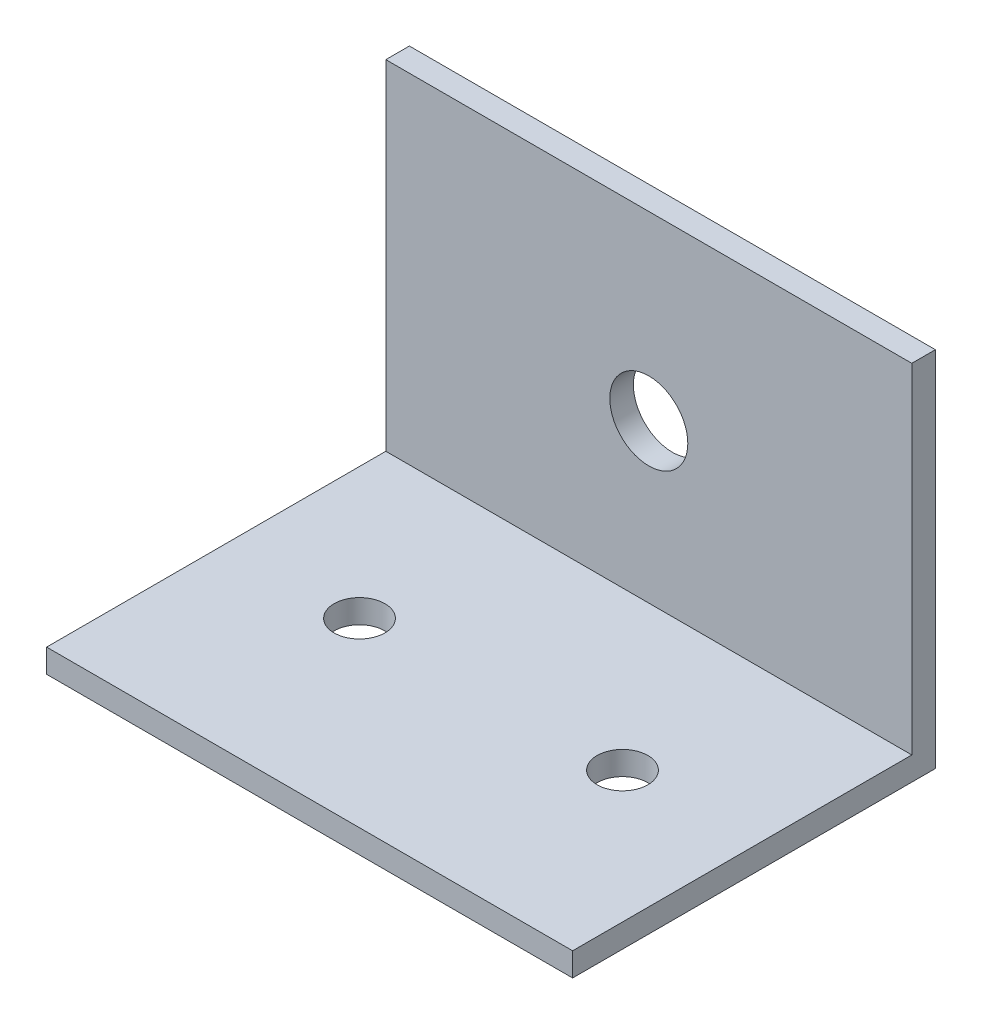
ISO-10303-21;
HEADER;
FILE_DESCRIPTION(('STEP AP214'),'2;1');
FILE_NAME('part.step','',(''),(''),'','','');
FILE_SCHEMA(('AUTOMOTIVE_DESIGN { 1 0 10303 214 1 1 1 1 }'));
ENDSEC;
DATA;
#1=APPLICATION_CONTEXT('core data for automotive mechanical design processes');
#2=APPLICATION_PROTOCOL_DEFINITION('international standard','automotive_design',2000,#1);
#3=PRODUCT_CONTEXT('',#1,'mechanical');
#4=PRODUCT('Part','Part','',(#3));
#5=PRODUCT_RELATED_PRODUCT_CATEGORY('part','',(#4));
#6=PRODUCT_DEFINITION_FORMATION('','',#4);
#7=PRODUCT_DEFINITION_CONTEXT('part definition',#1,'design');
#8=PRODUCT_DEFINITION('design','',#6,#7);
#9=PRODUCT_DEFINITION_SHAPE('','',#8);
#10=(LENGTH_UNIT() NAMED_UNIT(*) SI_UNIT(.MILLI.,.METRE.));
#11=(NAMED_UNIT(*) PLANE_ANGLE_UNIT() SI_UNIT($,.RADIAN.));
#12=(NAMED_UNIT(*) SI_UNIT($,.STERADIAN.) SOLID_ANGLE_UNIT());
#13=UNCERTAINTY_MEASURE_WITH_UNIT(LENGTH_MEASURE(1.E-05),#10,'distance_accuracy_value','');
#14=(GEOMETRIC_REPRESENTATION_CONTEXT(3) GLOBAL_UNCERTAINTY_ASSIGNED_CONTEXT((#13)) GLOBAL_UNIT_ASSIGNED_CONTEXT((#10,
#11,#12)) REPRESENTATION_CONTEXT('',''));
#15=CARTESIAN_POINT('',(0.,0.,0.));
#16=DIRECTION('',(0.,0.,1.));
#17=DIRECTION('',(1.,0.,0.));
#18=AXIS2_PLACEMENT_3D('',#15,#16,#17);
#19=CARTESIAN_POINT('',(36.83,25.4,3.302));
#20=DIRECTION('',(-1.,0.,0.));
#21=DIRECTION('',(0.,0.,1.));
#22=AXIS2_PLACEMENT_3D('',#19,#20,#21);
#23=PLANE('',#22);
#24=DIRECTION('',(0.,1.,0.));
#25=VECTOR('',#24,1.);
#26=CARTESIAN_POINT('',(36.83,25.4,0.));
#27=LINE('',#26,#25);
#28=CARTESIAN_POINT('',(36.83,-25.4,0.));
#29=VERTEX_POINT('',#28);
#30=CARTESIAN_POINT('',(36.83,25.4,0.));
#31=VERTEX_POINT('',#30);
#32=EDGE_CURVE('E102',#29,#31,#27,.T.);
#33=ORIENTED_EDGE('',*,*,#32,.T.);
#34=DIRECTION('',(0.,0.,-1.));
#35=VECTOR('',#34,1.);
#36=CARTESIAN_POINT('',(36.83,25.4,3.302));
#37=LINE('',#36,#35);
#38=CARTESIAN_POINT('',(36.83,25.4,3.302));
#39=VERTEX_POINT('',#38);
#40=EDGE_CURVE('E11',#39,#31,#37,.T.);
#41=ORIENTED_EDGE('',*,*,#40,.F.);
#42=DIRECTION('',(0.,1.,0.));
#43=VECTOR('',#42,1.);
#44=CARTESIAN_POINT('',(36.83,25.4,3.302));
#45=LINE('',#44,#43);
#46=CARTESIAN_POINT('',(36.83,-22.098,3.302));
#47=VERTEX_POINT('',#46);
#48=EDGE_CURVE('E95',#47,#39,#45,.T.);
#49=ORIENTED_EDGE('',*,*,#48,.F.);
#50=DIRECTION('',(0.,0.,-1.));
#51=VECTOR('',#50,1.);
#52=CARTESIAN_POINT('',(36.83,-22.098,50.8));
#53=LINE('',#52,#51);
#54=CARTESIAN_POINT('',(36.83,-22.098,50.8));
#55=VERTEX_POINT('',#54);
#56=EDGE_CURVE('E110',#55,#47,#53,.T.);
#57=ORIENTED_EDGE('',*,*,#56,.F.);
#58=DIRECTION('',(0.,1.,0.));
#59=VECTOR('',#58,1.);
#60=CARTESIAN_POINT('',(36.83,-25.4,50.8));
#61=LINE('',#60,#59);
#62=CARTESIAN_POINT('',(36.83,-25.4,50.8));
#63=VERTEX_POINT('',#62);
#64=EDGE_CURVE('E105',#63,#55,#61,.T.);
#65=ORIENTED_EDGE('',*,*,#64,.F.);
#66=DIRECTION('',(0.,0.,-1.));
#67=VECTOR('',#66,1.);
#68=CARTESIAN_POINT('',(36.83,-25.4,3.302));
#69=LINE('',#68,#67);
#70=EDGE_CURVE('E88',#63,#29,#69,.T.);
#71=ORIENTED_EDGE('',*,*,#70,.T.);
#72=EDGE_LOOP('',(#33,#41,#49,#57,#65,#71));
#73=FACE_BOUND('',#72,.T.);
#74=ADVANCED_FACE('F41',(#73),#23,.F.);
#75=CARTESIAN_POINT('',(-36.83,25.4,3.302));
#76=DIRECTION('',(0.,-1.,0.));
#77=DIRECTION('',(0.,0.,-1.));
#78=AXIS2_PLACEMENT_3D('',#75,#76,#77);
#79=PLANE('',#78);
#80=DIRECTION('',(-1.,0.,0.));
#81=VECTOR('',#80,1.);
#82=CARTESIAN_POINT('',(-36.83,25.4,0.));
#83=LINE('',#82,#81);
#84=CARTESIAN_POINT('',(-36.83,25.4,0.));
#85=VERTEX_POINT('',#84);
#86=EDGE_CURVE('E109',#31,#85,#83,.T.);
#87=ORIENTED_EDGE('',*,*,#86,.T.);
#88=DIRECTION('',(0.,0.,-1.));
#89=VECTOR('',#88,1.);
#90=CARTESIAN_POINT('',(-36.83,25.4,3.302));
#91=LINE('',#90,#89);
#92=CARTESIAN_POINT('',(-36.83,25.4,3.302));
#93=VERTEX_POINT('',#92);
#94=EDGE_CURVE('E49',#93,#85,#91,.T.);
#95=ORIENTED_EDGE('',*,*,#94,.F.);
#96=DIRECTION('',(-1.,0.,0.));
#97=VECTOR('',#96,1.);
#98=CARTESIAN_POINT('',(-36.83,25.4,3.302));
#99=LINE('',#98,#97);
#100=EDGE_CURVE('E63',#39,#93,#99,.T.);
#101=ORIENTED_EDGE('',*,*,#100,.F.);
#102=ORIENTED_EDGE('',*,*,#40,.T.);
#103=EDGE_LOOP('',(#87,#95,#101,#102));
#104=FACE_BOUND('',#103,.T.);
#105=ADVANCED_FACE('F173',(#104),#79,.F.);
#106=CARTESIAN_POINT('',(-36.83,25.4,3.302));
#107=DIRECTION('',(1.,0.,0.));
#108=DIRECTION('',(0.,0.,-1.));
#109=AXIS2_PLACEMENT_3D('',#106,#107,#108);
#110=PLANE('',#109);
#111=DIRECTION('',(0.,-1.,0.));
#112=VECTOR('',#111,1.);
#113=CARTESIAN_POINT('',(-36.83,25.4,0.));
#114=LINE('',#113,#112);
#115=CARTESIAN_POINT('',(-36.83,-25.4,0.));
#116=VERTEX_POINT('',#115);
#117=EDGE_CURVE('E96',#85,#116,#114,.T.);
#118=ORIENTED_EDGE('',*,*,#117,.T.);
#119=DIRECTION('',(0.,0.,-1.));
#120=VECTOR('',#119,1.);
#121=CARTESIAN_POINT('',(-36.83,-25.4,3.302));
#122=LINE('',#121,#120);
#123=CARTESIAN_POINT('',(-36.83,-25.4,50.8));
#124=VERTEX_POINT('',#123);
#125=EDGE_CURVE('E91',#124,#116,#122,.T.);
#126=ORIENTED_EDGE('',*,*,#125,.F.);
#127=DIRECTION('',(0.,-1.,0.));
#128=VECTOR('',#127,1.);
#129=CARTESIAN_POINT('',(-36.83,-25.4,50.8));
#130=LINE('',#129,#128);
#131=CARTESIAN_POINT('',(-36.83,-22.098,50.8));
#132=VERTEX_POINT('',#131);
#133=EDGE_CURVE('E142',#132,#124,#130,.T.);
#134=ORIENTED_EDGE('',*,*,#133,.F.);
#135=DIRECTION('',(0.,0.,-1.));
#136=VECTOR('',#135,1.);
#137=CARTESIAN_POINT('',(-36.83,-22.098,50.8));
#138=LINE('',#137,#136);
#139=CARTESIAN_POINT('',(-36.83,-22.098,3.302));
#140=VERTEX_POINT('',#139);
#141=EDGE_CURVE('E114',#132,#140,#138,.T.);
#142=ORIENTED_EDGE('',*,*,#141,.T.);
#143=DIRECTION('',(0.,-1.,0.));
#144=VECTOR('',#143,1.);
#145=CARTESIAN_POINT('',(-36.83,25.4,3.302));
#146=LINE('',#145,#144);
#147=EDGE_CURVE('E106',#93,#140,#146,.T.);
#148=ORIENTED_EDGE('',*,*,#147,.F.);
#149=ORIENTED_EDGE('',*,*,#94,.T.);
#150=EDGE_LOOP('',(#118,#126,#134,#142,#148,#149));
#151=FACE_BOUND('',#150,.T.);
#152=ADVANCED_FACE('F164',(#151),#110,.F.);
#153=CARTESIAN_POINT('',(-36.83,-25.4,3.302));
#154=DIRECTION('',(0.,1.,0.));
#155=DIRECTION('',(0.,0.,1.));
#156=AXIS2_PLACEMENT_3D('',#153,#154,#155);
#157=PLANE('',#156);
#158=CARTESIAN_POINT('',(-18.415,-25.4,25.4));
#159=DIRECTION('',(0.,-1.,0.));
#160=DIRECTION('',(0.,0.,-1.));
#161=AXIS2_PLACEMENT_3D('',#158,#159,#160);
#162=CIRCLE('',#161,3.556);
#163=CARTESIAN_POINT('',(-18.415,-25.4,21.844));
#164=VERTEX_POINT('',#163);
#165=EDGE_CURVE('E124',#164,#164,#162,.T.);
#166=ORIENTED_EDGE('',*,*,#165,.F.);
#167=EDGE_LOOP('',(#166));
#168=FACE_BOUND('',#167,.T.);
#169=CARTESIAN_POINT('',(18.415,-25.4,25.4));
#170=DIRECTION('',(0.,-1.,0.));
#171=DIRECTION('',(0.,0.,-1.));
#172=AXIS2_PLACEMENT_3D('',#169,#170,#171);
#173=CIRCLE('',#172,3.556);
#174=CARTESIAN_POINT('',(18.415,-25.4,21.844));
#175=VERTEX_POINT('',#174);
#176=EDGE_CURVE('E130',#175,#175,#173,.T.);
#177=ORIENTED_EDGE('',*,*,#176,.F.);
#178=EDGE_LOOP('',(#177));
#179=FACE_BOUND('',#178,.T.);
#180=DIRECTION('',(1.,0.,0.));
#181=VECTOR('',#180,1.);
#182=CARTESIAN_POINT('',(-36.83,-25.4,0.));
#183=LINE('',#182,#181);
#184=EDGE_CURVE('E83',#116,#29,#183,.T.);
#185=ORIENTED_EDGE('',*,*,#184,.T.);
#186=ORIENTED_EDGE('',*,*,#70,.F.);
#187=DIRECTION('',(1.,0.,0.));
#188=VECTOR('',#187,1.);
#189=CARTESIAN_POINT('',(-36.83,-25.4,50.8));
#190=LINE('',#189,#188);
#191=EDGE_CURVE('E145',#124,#63,#190,.T.);
#192=ORIENTED_EDGE('',*,*,#191,.F.);
#193=ORIENTED_EDGE('',*,*,#125,.T.);
#194=EDGE_LOOP('',(#185,#186,#192,#193));
#195=FACE_BOUND('',#194,.T.);
#196=ADVANCED_FACE('F85',(#168,#179,#195),#157,.F.);
#197=CARTESIAN_POINT('',(0.,0.,3.302));
#198=DIRECTION('',(0.,0.,1.));
#199=DIRECTION('',(1.,0.,0.));
#200=AXIS2_PLACEMENT_3D('',#197,#198,#199);
#201=PLANE('',#200);
#202=CARTESIAN_POINT('',(0.,0.,3.302));
#203=DIRECTION('',(0.,0.,1.));
#204=DIRECTION('',(1.,0.,0.));
#205=AXIS2_PLACEMENT_3D('',#202,#203,#204);
#206=CIRCLE('',#205,5.461);
#207=CARTESIAN_POINT('',(5.461,0.,3.302));
#208=VERTEX_POINT('',#207);
#209=EDGE_CURVE('E139',#208,#208,#206,.T.);
#210=ORIENTED_EDGE('',*,*,#209,.F.);
#211=EDGE_LOOP('',(#210));
#212=FACE_BOUND('',#211,.T.);
#213=DIRECTION('',(-1.,0.,0.));
#214=VECTOR('',#213,1.);
#215=CARTESIAN_POINT('',(-36.83,-22.098,3.302));
#216=LINE('',#215,#214);
#217=EDGE_CURVE('E57',#47,#140,#216,.T.);
#218=ORIENTED_EDGE('',*,*,#217,.F.);
#219=ORIENTED_EDGE('',*,*,#48,.T.);
#220=ORIENTED_EDGE('',*,*,#100,.T.);
#221=ORIENTED_EDGE('',*,*,#147,.T.);
#222=EDGE_LOOP('',(#218,#219,#220,#221));
#223=FACE_BOUND('',#222,.T.);
#224=ADVANCED_FACE('F156',(#212,#223),#201,.T.);
#225=CARTESIAN_POINT('',(0.,0.,0.));
#226=DIRECTION('',(0.,0.,1.));
#227=DIRECTION('',(1.,0.,0.));
#228=AXIS2_PLACEMENT_3D('',#225,#226,#227);
#229=PLANE('',#228);
#230=CARTESIAN_POINT('',(0.,0.,0.));
#231=DIRECTION('',(0.,0.,-1.));
#232=DIRECTION('',(-1.,0.,0.));
#233=AXIS2_PLACEMENT_3D('',#230,#231,#232);
#234=CIRCLE('',#233,5.461);
#235=CARTESIAN_POINT('',(-5.461,0.,0.));
#236=VERTEX_POINT('',#235);
#237=EDGE_CURVE('E128',#236,#236,#234,.T.);
#238=ORIENTED_EDGE('',*,*,#237,.F.);
#239=EDGE_LOOP('',(#238));
#240=FACE_BOUND('',#239,.T.);
#241=ORIENTED_EDGE('',*,*,#32,.F.);
#242=ORIENTED_EDGE('',*,*,#184,.F.);
#243=ORIENTED_EDGE('',*,*,#117,.F.);
#244=ORIENTED_EDGE('',*,*,#86,.F.);
#245=EDGE_LOOP('',(#241,#242,#243,#244));
#246=FACE_BOUND('',#245,.T.);
#247=ADVANCED_FACE('F108',(#240,#246),#229,.F.);
#248=CARTESIAN_POINT('',(-36.83,-22.098,50.8));
#249=DIRECTION('',(0.,-1.,0.));
#250=DIRECTION('',(0.,0.,-1.));
#251=AXIS2_PLACEMENT_3D('',#248,#249,#250);
#252=PLANE('',#251);
#253=CARTESIAN_POINT('',(-18.415,-22.098,25.4));
#254=DIRECTION('',(0.,-1.,0.));
#255=DIRECTION('',(0.,0.,-1.));
#256=AXIS2_PLACEMENT_3D('',#253,#254,#255);
#257=CIRCLE('',#256,3.556);
#258=CARTESIAN_POINT('',(-18.415,-22.098,21.844));
#259=VERTEX_POINT('',#258);
#260=EDGE_CURVE('E44',#259,#259,#257,.T.);
#261=ORIENTED_EDGE('',*,*,#260,.T.);
#262=EDGE_LOOP('',(#261));
#263=FACE_BOUND('',#262,.T.);
#264=CARTESIAN_POINT('',(18.415,-22.098,25.4));
#265=DIRECTION('',(0.,-1.,0.));
#266=DIRECTION('',(0.,0.,-1.));
#267=AXIS2_PLACEMENT_3D('',#264,#265,#266);
#268=CIRCLE('',#267,3.556);
#269=CARTESIAN_POINT('',(18.415,-22.098,21.844));
#270=VERTEX_POINT('',#269);
#271=EDGE_CURVE('E122',#270,#270,#268,.T.);
#272=ORIENTED_EDGE('',*,*,#271,.T.);
#273=EDGE_LOOP('',(#272));
#274=FACE_BOUND('',#273,.T.);
#275=ORIENTED_EDGE('',*,*,#217,.T.);
#276=ORIENTED_EDGE('',*,*,#141,.F.);
#277=DIRECTION('',(-1.,0.,0.));
#278=VECTOR('',#277,1.);
#279=CARTESIAN_POINT('',(-36.83,-22.098,50.8));
#280=LINE('',#279,#278);
#281=EDGE_CURVE('E148',#55,#132,#280,.T.);
#282=ORIENTED_EDGE('',*,*,#281,.F.);
#283=ORIENTED_EDGE('',*,*,#56,.T.);
#284=EDGE_LOOP('',(#275,#276,#282,#283));
#285=FACE_BOUND('',#284,.T.);
#286=ADVANCED_FACE('F161',(#263,#274,#285),#252,.F.);
#287=CARTESIAN_POINT('',(0.,0.,50.8));
#288=DIRECTION('',(0.,0.,-1.));
#289=DIRECTION('',(-1.,0.,0.));
#290=AXIS2_PLACEMENT_3D('',#287,#288,#289);
#291=PLANE('',#290);
#292=ORIENTED_EDGE('',*,*,#133,.T.);
#293=ORIENTED_EDGE('',*,*,#191,.T.);
#294=ORIENTED_EDGE('',*,*,#64,.T.);
#295=ORIENTED_EDGE('',*,*,#281,.T.);
#296=EDGE_LOOP('',(#292,#293,#294,#295));
#297=FACE_BOUND('',#296,.T.);
#298=ADVANCED_FACE('F168',(#297),#291,.F.);
#299=CARTESIAN_POINT('',(0.,0.,50.8));
#300=DIRECTION('',(0.,0.,-1.));
#301=DIRECTION('',(-1.,0.,0.));
#302=AXIS2_PLACEMENT_3D('',#299,#300,#301);
#303=CYLINDRICAL_SURFACE('',#302,5.461);
#304=ORIENTED_EDGE('',*,*,#209,.T.);
#305=EDGE_LOOP('',(#304));
#306=FACE_BOUND('',#305,.T.);
#307=ORIENTED_EDGE('',*,*,#237,.T.);
#308=EDGE_LOOP('',(#307));
#309=FACE_BOUND('',#308,.T.);
#310=ADVANCED_FACE('F195',(#306,#309),#303,.F.);
#311=CARTESIAN_POINT('',(18.415,25.4,25.4));
#312=DIRECTION('',(0.,-1.,0.));
#313=DIRECTION('',(0.,0.,-1.));
#314=AXIS2_PLACEMENT_3D('',#311,#312,#313);
#315=CYLINDRICAL_SURFACE('',#314,3.556);
#316=ORIENTED_EDGE('',*,*,#176,.T.);
#317=EDGE_LOOP('',(#316));
#318=FACE_BOUND('',#317,.T.);
#319=ORIENTED_EDGE('',*,*,#271,.F.);
#320=EDGE_LOOP('',(#319));
#321=FACE_BOUND('',#320,.T.);
#322=ADVANCED_FACE('F198',(#318,#321),#315,.F.);
#323=CARTESIAN_POINT('',(-18.415,25.4,25.4));
#324=DIRECTION('',(0.,-1.,0.));
#325=DIRECTION('',(0.,0.,-1.));
#326=AXIS2_PLACEMENT_3D('',#323,#324,#325);
#327=CYLINDRICAL_SURFACE('',#326,3.556);
#328=ORIENTED_EDGE('',*,*,#165,.T.);
#329=EDGE_LOOP('',(#328));
#330=FACE_BOUND('',#329,.T.);
#331=ORIENTED_EDGE('',*,*,#260,.F.);
#332=EDGE_LOOP('',(#331));
#333=FACE_BOUND('',#332,.T.);
#334=ADVANCED_FACE('F202',(#330,#333),#327,.F.);
#335=CLOSED_SHELL('',(#74,#105,#152,#196,#224,#247,#286,#298,#310,#322,#334));
#336=MANIFOLD_SOLID_BREP('B2',#335);
#337=ADVANCED_BREP_SHAPE_REPRESENTATION('',(#18,#336),#14);
#338=SHAPE_DEFINITION_REPRESENTATION(#9,#337);
ENDSEC;
END-ISO-10303-21;
